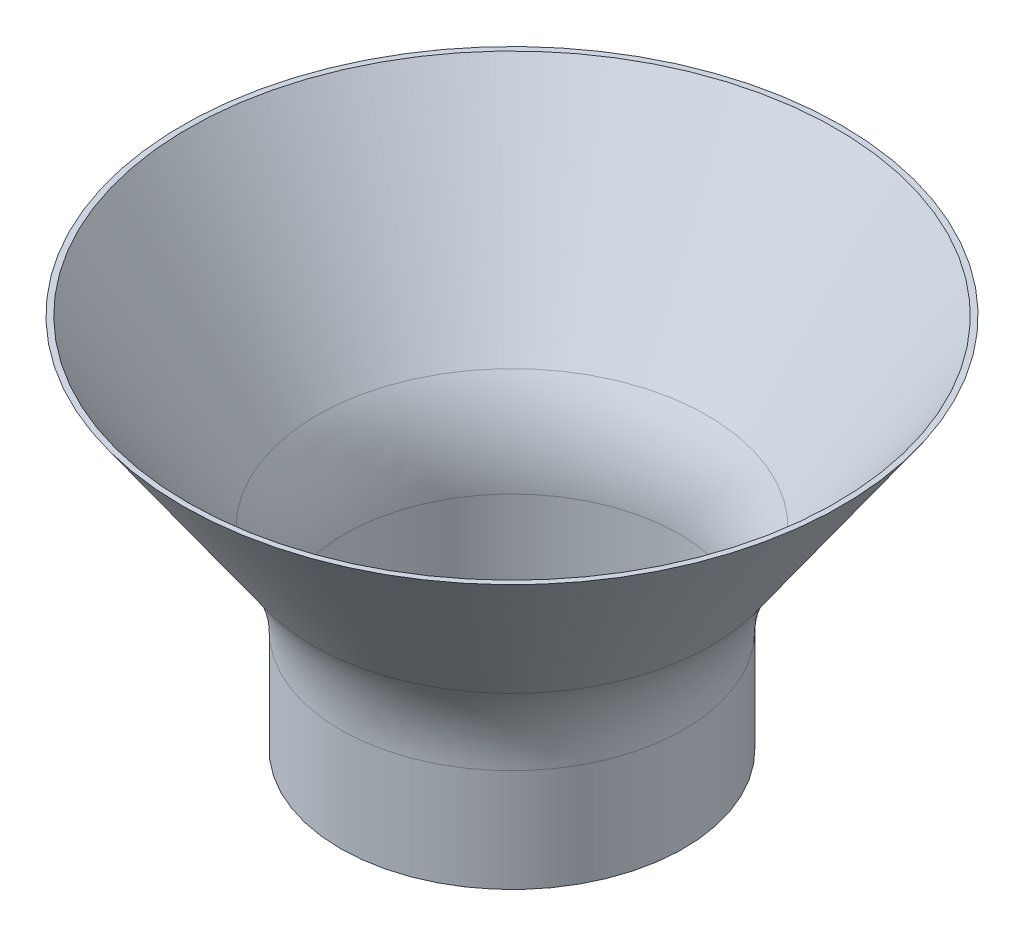
ISO-10303-21;
HEADER;
FILE_DESCRIPTION(('STEP AP214'),'2;1');
FILE_NAME('part.step','',(''),(''),'','','');
FILE_SCHEMA(('AUTOMOTIVE_DESIGN { 1 0 10303 214 1 1 1 1 }'));
ENDSEC;
DATA;
#1=APPLICATION_CONTEXT('core data for automotive mechanical design processes');
#2=APPLICATION_PROTOCOL_DEFINITION('international standard','automotive_design',2000,#1);
#3=PRODUCT_CONTEXT('',#1,'mechanical');
#4=PRODUCT('Part','Part','',(#3));
#5=PRODUCT_RELATED_PRODUCT_CATEGORY('part','',(#4));
#6=PRODUCT_DEFINITION_FORMATION('','',#4);
#7=PRODUCT_DEFINITION_CONTEXT('part definition',#1,'design');
#8=PRODUCT_DEFINITION('design','',#6,#7);
#9=PRODUCT_DEFINITION_SHAPE('','',#8);
#10=(LENGTH_UNIT() NAMED_UNIT(*) SI_UNIT(.MILLI.,.METRE.));
#11=(NAMED_UNIT(*) PLANE_ANGLE_UNIT() SI_UNIT($,.RADIAN.));
#12=(NAMED_UNIT(*) SI_UNIT($,.STERADIAN.) SOLID_ANGLE_UNIT());
#13=UNCERTAINTY_MEASURE_WITH_UNIT(LENGTH_MEASURE(1.E-05),#10,'distance_accuracy_value','');
#14=(GEOMETRIC_REPRESENTATION_CONTEXT(3) GLOBAL_UNCERTAINTY_ASSIGNED_CONTEXT((#13)) GLOBAL_UNIT_ASSIGNED_CONTEXT((#10,
#11,#12)) REPRESENTATION_CONTEXT('',''));
#15=CARTESIAN_POINT('',(0.,0.,0.));
#16=DIRECTION('',(0.,0.,1.));
#17=DIRECTION('',(1.,0.,0.));
#18=AXIS2_PLACEMENT_3D('',#15,#16,#17);
#19=CARTESIAN_POINT('',(0.,25.4,0.));
#20=DIRECTION('',(0.,-1.,0.));
#21=DIRECTION('',(0.,0.,-1.));
#22=AXIS2_PLACEMENT_3D('',#19,#20,#21);
#23=CYLINDRICAL_SURFACE('',#22,29.0449);
#24=CARTESIAN_POINT('',(0.,17.3914107624738,0.));
#25=DIRECTION('',(0.,1.,0.));
#26=DIRECTION('',(0.,0.,1.));
#27=AXIS2_PLACEMENT_3D('',#24,#25,#26);
#28=CIRCLE('',#27,29.0449);
#29=CARTESIAN_POINT('',(0.,17.3914107624738,29.0449));
#30=VERTEX_POINT('',#29);
#31=EDGE_CURVE('E10',#30,#30,#28,.F.);
#32=ORIENTED_EDGE('',*,*,#31,.T.);
#33=EDGE_LOOP('',(#32));
#34=FACE_BOUND('',#33,.T.);
#35=CARTESIAN_POINT('',(0.,0.,0.));
#36=DIRECTION('',(0.,1.,0.));
#37=DIRECTION('',(0.,0.,1.));
#38=AXIS2_PLACEMENT_3D('',#35,#36,#37);
#39=CIRCLE('',#38,29.0449);
#40=CARTESIAN_POINT('',(0.,0.,29.0449));
#41=VERTEX_POINT('',#40);
#42=EDGE_CURVE('E42',#41,#41,#39,.T.);
#43=ORIENTED_EDGE('',*,*,#42,.T.);
#44=EDGE_LOOP('',(#43));
#45=FACE_BOUND('',#44,.T.);
#46=ADVANCED_FACE('F31',(#34,#45),#23,.T.);
#47=CARTESIAN_POINT('',(0.,0.,0.));
#48=DIRECTION('',(0.,1.,0.));
#49=DIRECTION('',(0.,0.,1.));
#50=AXIS2_PLACEMENT_3D('',#47,#48,#49);
#51=PLANE('',#50);
#52=CARTESIAN_POINT('',(0.,0.,0.));
#53=DIRECTION('',(0.,1.,0.));
#54=DIRECTION('',(0.,0.,1.));
#55=AXIS2_PLACEMENT_3D('',#52,#53,#54);
#56=CIRCLE('',#55,28.2829);
#57=CARTESIAN_POINT('',(0.,0.,28.2829));
#58=VERTEX_POINT('',#57);
#59=EDGE_CURVE('E55',#58,#58,#56,.T.);
#60=ORIENTED_EDGE('',*,*,#59,.T.);
#61=EDGE_LOOP('',(#60));
#62=FACE_BOUND('',#61,.T.);
#63=ORIENTED_EDGE('',*,*,#42,.F.);
#64=EDGE_LOOP('',(#63));
#65=FACE_BOUND('',#64,.T.);
#66=ADVANCED_FACE('F74',(#62,#65),#51,.F.);
#67=CARTESIAN_POINT('',(0.,25.4,0.));
#68=DIRECTION('',(0.,1.,0.));
#69=DIRECTION('',(0.,0.,1.));
#70=AXIS2_PLACEMENT_3D('',#67,#68,#69);
#71=CONICAL_SURFACE('',#70,29.0449,0.610865238198017);
#72=CARTESIAN_POINT('',(0.,31.9602522457904,0.));
#73=DIRECTION('',(0.,1.,0.));
#74=DIRECTION('',(0.,0.,1.));
#75=AXIS2_PLACEMENT_3D('',#72,#73,#74);
#76=CIRCLE('',#75,33.6384380750596);
#77=CARTESIAN_POINT('',(0.,31.9602522457904,33.6384380750596));
#78=VERTEX_POINT('',#77);
#79=EDGE_CURVE('E38',#78,#78,#76,.T.);
#80=ORIENTED_EDGE('',*,*,#79,.T.);
#81=EDGE_LOOP('',(#80));
#82=FACE_BOUND('',#81,.T.);
#83=CARTESIAN_POINT('',(0.,63.5,0.));
#84=DIRECTION('',(0.,1.,0.));
#85=DIRECTION('',(0.,0.,1.));
#86=AXIS2_PLACEMENT_3D('',#83,#84,#85);
#87=CIRCLE('',#86,55.72280720579);
#88=CARTESIAN_POINT('',(0.,63.5,55.72280720579));
#89=VERTEX_POINT('',#88);
#90=EDGE_CURVE('E46',#89,#89,#87,.T.);
#91=ORIENTED_EDGE('',*,*,#90,.F.);
#92=EDGE_LOOP('',(#91));
#93=FACE_BOUND('',#92,.T.);
#94=ADVANCED_FACE('F77',(#82,#93),#71,.T.);
#95=CARTESIAN_POINT('',(0.,63.5,0.));
#96=DIRECTION('',(0.,1.,0.));
#97=DIRECTION('',(0.,0.,1.));
#98=AXIS2_PLACEMENT_3D('',#95,#96,#97);
#99=PLANE('',#98);
#100=CARTESIAN_POINT('',(0.,63.5,0.));
#101=DIRECTION('',(0.,1.,0.));
#102=DIRECTION('',(0.,0.,1.));
#103=AXIS2_PLACEMENT_3D('',#100,#101,#102);
#104=CIRCLE('',#103,54.7925769691538);
#105=CARTESIAN_POINT('',(0.,63.5,54.7925769691538));
#106=VERTEX_POINT('',#105);
#107=EDGE_CURVE('E52',#106,#106,#104,.T.);
#108=ORIENTED_EDGE('',*,*,#107,.F.);
#109=EDGE_LOOP('',(#108));
#110=FACE_BOUND('',#109,.T.);
#111=ORIENTED_EDGE('',*,*,#90,.T.);
#112=EDGE_LOOP('',(#111));
#113=FACE_BOUND('',#112,.T.);
#114=ADVANCED_FACE('F87',(#110,#113),#99,.T.);
#115=CARTESIAN_POINT('',(0.,17.3914107624738,0.));
#116=DIRECTION('',(0.,1.,0.));
#117=DIRECTION('',(0.,0.,1.));
#118=AXIS2_PLACEMENT_3D('',#115,#116,#117);
#119=TOROIDAL_SURFACE('',#118,54.4449,25.4);
#120=ORIENTED_EDGE('',*,*,#31,.F.);
#121=EDGE_LOOP('',(#120));
#122=FACE_BOUND('',#121,.T.);
#123=ORIENTED_EDGE('',*,*,#79,.F.);
#124=EDGE_LOOP('',(#123));
#125=FACE_BOUND('',#124,.T.);
#126=ADVANCED_FACE('F33',(#122,#125),#119,.F.);
#127=CARTESIAN_POINT('',(0.,25.4,0.));
#128=DIRECTION('',(0.,-1.,0.));
#129=DIRECTION('',(0.,0.,-1.));
#130=AXIS2_PLACEMENT_3D('',#127,#128,#129);
#131=CYLINDRICAL_SURFACE('',#130,28.2829);
#132=CARTESIAN_POINT('',(0.,17.3914107624738,0.));
#133=DIRECTION('',(0.,-1.,0.));
#134=DIRECTION('',(0.,0.,-1.));
#135=AXIS2_PLACEMENT_3D('',#132,#133,#134);
#136=CIRCLE('',#135,28.2829);
#137=CARTESIAN_POINT('',(0.,17.3914107624738,-28.2829));
#138=VERTEX_POINT('',#137);
#139=EDGE_CURVE('E51',#138,#138,#136,.T.);
#140=ORIENTED_EDGE('',*,*,#139,.F.);
#141=EDGE_LOOP('',(#140));
#142=FACE_BOUND('',#141,.T.);
#143=ORIENTED_EDGE('',*,*,#59,.F.);
#144=EDGE_LOOP('',(#143));
#145=FACE_BOUND('',#144,.T.);
#146=ADVANCED_FACE('F67',(#142,#145),#131,.F.);
#147=CARTESIAN_POINT('',(0.,25.8370652444995,0.));
#148=DIRECTION('',(0.,1.,0.));
#149=DIRECTION('',(0.,0.,1.));
#150=AXIS2_PLACEMENT_3D('',#147,#148,#149);
#151=CONICAL_SURFACE('',#150,28.4207061422518,0.610865238198017);
#152=CARTESIAN_POINT('',(0.,32.3973174902899,0.));
#153=DIRECTION('',(0.,1.,0.));
#154=DIRECTION('',(0.,0.,1.));
#155=AXIS2_PLACEMENT_3D('',#152,#153,#154);
#156=CIRCLE('',#155,33.0142442173114);
#157=CARTESIAN_POINT('',(0.,32.3973174902899,33.0142442173114));
#158=VERTEX_POINT('',#157);
#159=EDGE_CURVE('E58',#158,#158,#156,.T.);
#160=ORIENTED_EDGE('',*,*,#159,.F.);
#161=EDGE_LOOP('',(#160));
#162=FACE_BOUND('',#161,.T.);
#163=ORIENTED_EDGE('',*,*,#107,.T.);
#164=EDGE_LOOP('',(#163));
#165=FACE_BOUND('',#164,.T.);
#166=ADVANCED_FACE('F70',(#162,#165),#151,.F.);
#167=CARTESIAN_POINT('',(0.,17.3914107624738,0.));
#168=DIRECTION('',(0.,1.,0.));
#169=DIRECTION('',(0.,0.,1.));
#170=AXIS2_PLACEMENT_3D('',#167,#168,#169);
#171=TOROIDAL_SURFACE('',#170,54.4449,26.162);
#172=ORIENTED_EDGE('',*,*,#139,.T.);
#173=EDGE_LOOP('',(#172));
#174=FACE_BOUND('',#173,.T.);
#175=ORIENTED_EDGE('',*,*,#159,.T.);
#176=EDGE_LOOP('',(#175));
#177=FACE_BOUND('',#176,.T.);
#178=ADVANCED_FACE('F64',(#174,#177),#171,.T.);
#179=CLOSED_SHELL('',(#46,#66,#94,#114,#126,#146,#166,#178));
#180=MANIFOLD_SOLID_BREP('B2',#179);
#181=ADVANCED_BREP_SHAPE_REPRESENTATION('',(#18,#180),#14);
#182=SHAPE_DEFINITION_REPRESENTATION(#9,#181);
ENDSEC;
END-ISO-10303-21;
